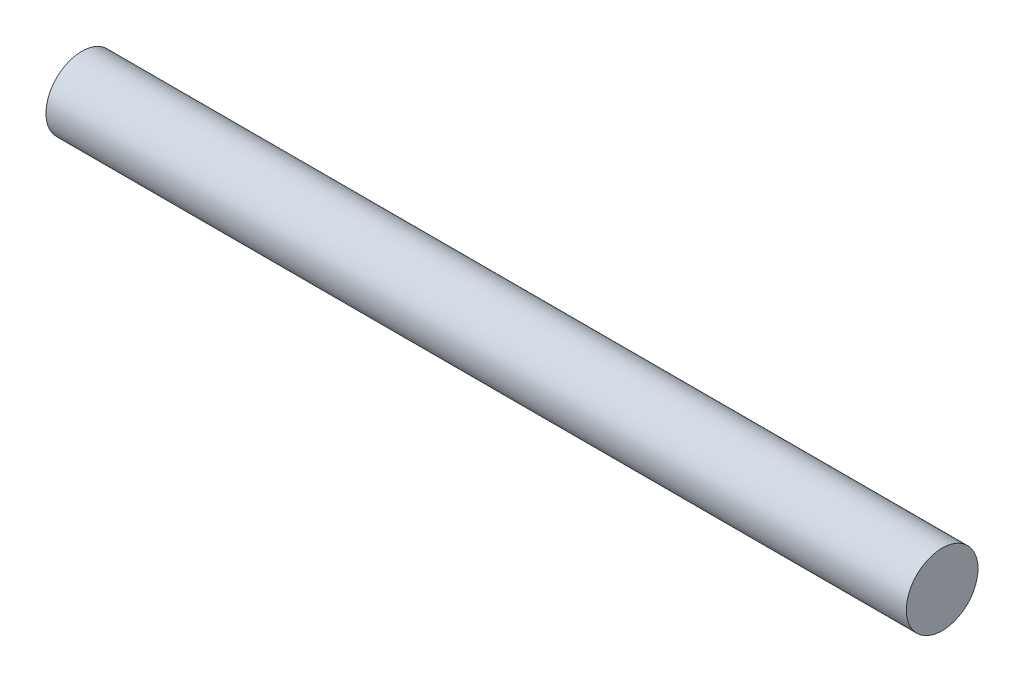
ISO-10303-21;
HEADER;
FILE_DESCRIPTION(('STEP AP214'),'2;1');
FILE_NAME('part.step','',(''),(''),'','','');
FILE_SCHEMA(('AUTOMOTIVE_DESIGN { 1 0 10303 214 1 1 1 1 }'));
ENDSEC;
DATA;
#1=APPLICATION_CONTEXT('core data for automotive mechanical design processes');
#2=APPLICATION_PROTOCOL_DEFINITION('international standard','automotive_design',2000,#1);
#3=PRODUCT_CONTEXT('',#1,'mechanical');
#4=PRODUCT('Part','Part','',(#3));
#5=PRODUCT_RELATED_PRODUCT_CATEGORY('part','',(#4));
#6=PRODUCT_DEFINITION_FORMATION('','',#4);
#7=PRODUCT_DEFINITION_CONTEXT('part definition',#1,'design');
#8=PRODUCT_DEFINITION('design','',#6,#7);
#9=PRODUCT_DEFINITION_SHAPE('','',#8);
#10=(LENGTH_UNIT() NAMED_UNIT(*) SI_UNIT(.MILLI.,.METRE.));
#11=(NAMED_UNIT(*) PLANE_ANGLE_UNIT() SI_UNIT($,.RADIAN.));
#12=(NAMED_UNIT(*) SI_UNIT($,.STERADIAN.) SOLID_ANGLE_UNIT());
#13=UNCERTAINTY_MEASURE_WITH_UNIT(LENGTH_MEASURE(1.E-05),#10,'distance_accuracy_value','');
#14=(GEOMETRIC_REPRESENTATION_CONTEXT(3) GLOBAL_UNCERTAINTY_ASSIGNED_CONTEXT((#13)) GLOBAL_UNIT_ASSIGNED_CONTEXT((#10,
#11,#12)) REPRESENTATION_CONTEXT('',''));
#15=CARTESIAN_POINT('',(0.,0.,0.));
#16=DIRECTION('',(0.,0.,1.));
#17=DIRECTION('',(1.,0.,0.));
#18=AXIS2_PLACEMENT_3D('',#15,#16,#17);
#19=CARTESIAN_POINT('',(36.,0.,0.));
#20=DIRECTION('',(-1.,0.,0.));
#21=DIRECTION('',(0.,0.,1.));
#22=AXIS2_PLACEMENT_3D('',#19,#20,#21);
#23=CYLINDRICAL_SURFACE('',#22,1.5);
#24=CARTESIAN_POINT('',(36.,0.,0.));
#25=DIRECTION('',(1.,0.,0.));
#26=DIRECTION('',(0.,0.,-1.));
#27=AXIS2_PLACEMENT_3D('',#24,#25,#26);
#28=CIRCLE('',#27,1.5);
#29=CARTESIAN_POINT('',(36.,0.,-1.5));
#30=VERTEX_POINT('',#29);
#31=EDGE_CURVE('E10',#30,#30,#28,.T.);
#32=ORIENTED_EDGE('',*,*,#31,.F.);
#33=EDGE_LOOP('',(#32));
#34=FACE_BOUND('',#33,.T.);
#35=CARTESIAN_POINT('',(0.,0.,0.));
#36=DIRECTION('',(1.,0.,0.));
#37=DIRECTION('',(0.,0.,-1.));
#38=AXIS2_PLACEMENT_3D('',#35,#36,#37);
#39=CIRCLE('',#38,1.5);
#40=CARTESIAN_POINT('',(0.,0.,-1.5));
#41=VERTEX_POINT('',#40);
#42=EDGE_CURVE('E34',#41,#41,#39,.T.);
#43=ORIENTED_EDGE('',*,*,#42,.T.);
#44=EDGE_LOOP('',(#43));
#45=FACE_BOUND('',#44,.T.);
#46=ADVANCED_FACE('F31',(#34,#45),#23,.T.);
#47=CARTESIAN_POINT('',(36.,0.,0.));
#48=DIRECTION('',(1.,0.,0.));
#49=DIRECTION('',(0.,0.,-1.));
#50=AXIS2_PLACEMENT_3D('',#47,#48,#49);
#51=PLANE('',#50);
#52=ORIENTED_EDGE('',*,*,#31,.T.);
#53=EDGE_LOOP('',(#52));
#54=FACE_BOUND('',#53,.T.);
#55=ADVANCED_FACE('F46',(#54),#51,.T.);
#56=CARTESIAN_POINT('',(0.,0.,0.));
#57=DIRECTION('',(1.,0.,0.));
#58=DIRECTION('',(0.,0.,-1.));
#59=AXIS2_PLACEMENT_3D('',#56,#57,#58);
#60=PLANE('',#59);
#61=ORIENTED_EDGE('',*,*,#42,.F.);
#62=EDGE_LOOP('',(#61));
#63=FACE_BOUND('',#62,.T.);
#64=ADVANCED_FACE('F44',(#63),#60,.F.);
#65=CLOSED_SHELL('',(#46,#55,#64));
#66=MANIFOLD_SOLID_BREP('B2',#65);
#67=ADVANCED_BREP_SHAPE_REPRESENTATION('',(#18,#66),#14);
#68=SHAPE_DEFINITION_REPRESENTATION(#9,#67);
ENDSEC;
END-ISO-10303-21;
